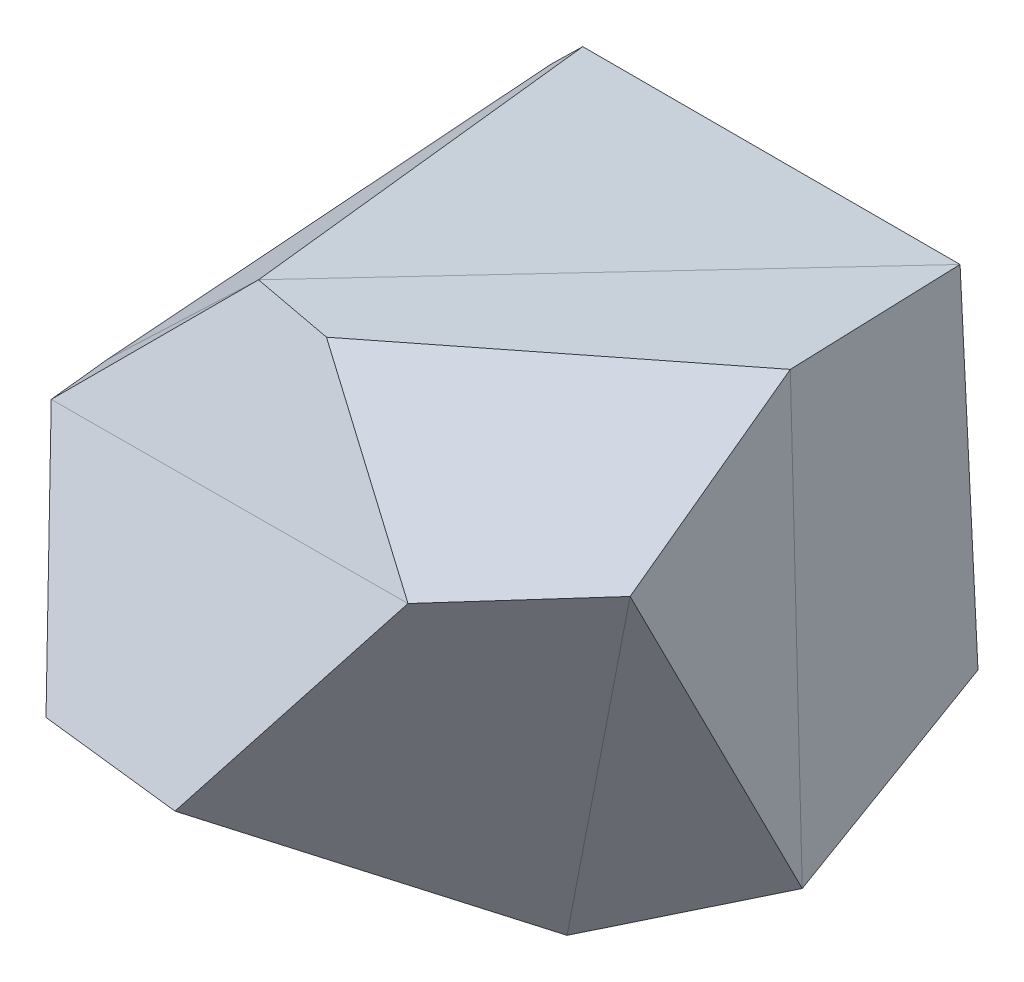
ISO-10303-21;
HEADER;
FILE_DESCRIPTION(('STEP AP214'),'2;1');
FILE_NAME('part.step','',(''),(''),'','','');
FILE_SCHEMA(('AUTOMOTIVE_DESIGN { 1 0 10303 214 1 1 1 1 }'));
ENDSEC;
DATA;
#1=APPLICATION_CONTEXT('core data for automotive mechanical design processes');
#2=APPLICATION_PROTOCOL_DEFINITION('international standard','automotive_design',2000,#1);
#3=PRODUCT_CONTEXT('',#1,'mechanical');
#4=PRODUCT('Part','Part','',(#3));
#5=PRODUCT_RELATED_PRODUCT_CATEGORY('part','',(#4));
#6=PRODUCT_DEFINITION_FORMATION('','',#4);
#7=PRODUCT_DEFINITION_CONTEXT('part definition',#1,'design');
#8=PRODUCT_DEFINITION('design','',#6,#7);
#9=PRODUCT_DEFINITION_SHAPE('','',#8);
#10=(LENGTH_UNIT() NAMED_UNIT(*) SI_UNIT(.MILLI.,.METRE.));
#11=(NAMED_UNIT(*) PLANE_ANGLE_UNIT() SI_UNIT($,.RADIAN.));
#12=(NAMED_UNIT(*) SI_UNIT($,.STERADIAN.) SOLID_ANGLE_UNIT());
#13=UNCERTAINTY_MEASURE_WITH_UNIT(LENGTH_MEASURE(1.E-05),#10,'distance_accuracy_value','');
#14=(GEOMETRIC_REPRESENTATION_CONTEXT(3) GLOBAL_UNCERTAINTY_ASSIGNED_CONTEXT((#13)) GLOBAL_UNIT_ASSIGNED_CONTEXT((#10,
#11,#12)) REPRESENTATION_CONTEXT('',''));
#15=CARTESIAN_POINT('',(0.,0.,0.));
#16=DIRECTION('',(0.,0.,1.));
#17=DIRECTION('',(1.,0.,0.));
#18=AXIS2_PLACEMENT_3D('',#15,#16,#17);
#19=CARTESIAN_POINT('',(-17.3170905850617,1.69383779565701,24.8144851609786));
#20=DIRECTION('',(-0.697306439009768,0.713370706215431,0.0697564737441214));
#21=DIRECTION('',(0.698510580917198,0.698142668591242,-0.157098003294179));
#22=AXIS2_PLACEMENT_3D('',#19,#20,#21);
#23=PLANE('',#22);
#24=DIRECTION('',(-0.698510580917198,-0.698142668591242,0.157098003294179));
#25=VECTOR('',#24,1.);
#26=CARTESIAN_POINT('',(-12.4275165186413,6.58083647579571,23.7147991379194));
#27=LINE('',#26,#25);
#28=CARTESIAN_POINT('',(-7.53794245222089,11.4678351559344,22.6151131148601));
#29=VERTEX_POINT('',#28);
#30=CARTESIAN_POINT('',(-17.3170905850617,1.69383779565701,24.8144851609786));
#31=VERTEX_POINT('',#30);
#32=EDGE_CURVE('E2373',#29,#31,#27,.T.);
#33=ORIENTED_EDGE('',*,*,#32,.F.);
#34=DIRECTION('',(0.716146176064987,0.689319770996764,0.10942078331133));
#35=VECTOR('',#34,1.);
#36=CARTESIAN_POINT('',(-12.6899135848342,6.50885376357589,21.8279376250384));
#37=LINE('',#36,#35);
#38=CARTESIAN_POINT('',(-17.8418847174476,1.54987237121737,21.0407621352167));
#39=VERTEX_POINT('',#38);
#40=EDGE_CURVE('E2360',#39,#29,#37,.T.);
#41=ORIENTED_EDGE('',*,*,#40,.F.);
#42=DIRECTION('',(-0.13764162046033,-0.0377588716932539,-0.989762118857611));
#43=VECTOR('',#42,1.);
#44=CARTESIAN_POINT('',(-17.5794876512546,1.62185508343719,22.9276236480976));
#45=LINE('',#44,#43);
#46=EDGE_CURVE('E2375',#31,#39,#45,.T.);
#47=ORIENTED_EDGE('',*,*,#46,.F.);
#48=EDGE_LOOP('',(#33,#41,#47));
#49=FACE_BOUND('',#48,.T.);
#50=ADVANCED_FACE('F2290',(#49),#23,.T.);
#51=CARTESIAN_POINT('',(-17.8418847174476,1.54987237121738,21.0407621352167));
#52=DIRECTION('',(-0.697306439009768,0.713370706215431,0.0697564737441219));
#53=DIRECTION('',(0.716146176064988,0.689319770996764,0.109420783311329));
#54=AXIS2_PLACEMENT_3D('',#51,#52,#53);
#55=PLANE('',#54);
#56=ORIENTED_EDGE('',*,*,#40,.T.);
#57=DIRECTION('',(-0.168703631068879,-0.068756641820179,-0.983265787602613));
#58=VECTOR('',#57,1.);
#59=CARTESIAN_POINT('',(-9.478034209513,10.6771337750023,11.3075565574301));
#60=LINE('',#59,#58);
#61=CARTESIAN_POINT('',(-11.4181259668051,9.88643239407028,0.));
#62=VERTEX_POINT('',#61);
#63=EDGE_CURVE('E2364',#29,#62,#60,.T.);
#64=ORIENTED_EDGE('',*,*,#63,.T.);
#65=DIRECTION('',(-0.715112684774103,-0.699009190265175,0.));
#66=VECTOR('',#65,1.);
#67=CARTESIAN_POINT('',(-13.2681531070752,8.07806568372831,0.));
#68=LINE('',#67,#66);
#69=CARTESIAN_POINT('',(-13.2681531070752,8.07806568372831,0.));
#70=VERTEX_POINT('',#69);
#71=EDGE_CURVE('E2398',#62,#70,#68,.T.);
#72=ORIENTED_EDGE('',*,*,#71,.T.);
#73=DIRECTION('',(-0.203276960460998,-0.290141925000486,0.935144983787407));
#74=VECTOR('',#73,1.);
#75=CARTESIAN_POINT('',(-15.5550189122614,4.81396902747284,10.5203810676083));
#76=LINE('',#75,#74);
#77=EDGE_CURVE('E2367',#70,#39,#76,.T.);
#78=ORIENTED_EDGE('',*,*,#77,.T.);
#79=EDGE_LOOP('',(#56,#64,#72,#78));
#80=FACE_BOUND('',#79,.T.);
#81=ADVANCED_FACE('F2362',(#80),#55,.T.);
#82=CARTESIAN_POINT('',(-7.53794245222089,11.4678351559344,22.6151131148601));
#83=DIRECTION('',(0.,-0.997564050259824,0.0697564737441288));
#84=DIRECTION('',(-0.168703631068879,-0.0687566418201791,-0.983265787602613));
#85=AXIS2_PLACEMENT_3D('',#82,#83,#84);
#86=PLANE('',#85);
#87=ORIENTED_EDGE('',*,*,#63,.F.);
#88=DIRECTION('',(0.620117057189685,-0.0547246021027576,-0.782598270702855));
#89=VECTOR('',#88,1.);
#90=CARTESIAN_POINT('',(1.421965790487,10.6771337750023,11.3075565574301));
#91=LINE('',#90,#89);
#92=CARTESIAN_POINT('',(10.3818740331949,9.88643239407028,0.));
#93=VERTEX_POINT('',#92);
#94=EDGE_CURVE('E2380',#29,#93,#91,.T.);
#95=ORIENTED_EDGE('',*,*,#94,.T.);
#96=DIRECTION('',(-1.,0.,0.));
#97=VECTOR('',#96,1.);
#98=CARTESIAN_POINT('',(10.3818740331949,9.88643239407028,0.));
#99=LINE('',#98,#97);
#100=EDGE_CURVE('E2387',#93,#62,#99,.T.);
#101=ORIENTED_EDGE('',*,*,#100,.T.);
#102=EDGE_LOOP('',(#87,#95,#101));
#103=FACE_BOUND('',#102,.T.);
#104=ADVANCED_FACE('F2383',(#103),#86,.F.);
#105=CARTESIAN_POINT('',(-17.3170905850617,1.69383779565702,24.8144851609786));
#106=DIRECTION('',(0.911844271777201,0.385377148631444,-0.1415078702398));
#107=DIRECTION('',(0.407239440110573,-0.805493803160699,0.430506412830448));
#108=AXIS2_PLACEMENT_3D('',#105,#106,#107);
#109=PLANE('',#108);
#110=DIRECTION('',(-0.407239440110573,0.805493803160698,-0.430506412830449));
#111=VECTOR('',#110,1.);
#112=CARTESIAN_POINT('',(-14.6700342243429,-3.54187192488753,27.6127768443765));
#113=LINE('',#112,#111);
#114=CARTESIAN_POINT('',(-12.0229778636242,-8.77758164543207,30.4110685277744));
#115=VERTEX_POINT('',#114);
#116=EDGE_CURVE('E2444',#115,#31,#113,.T.);
#117=ORIENTED_EDGE('',*,*,#116,.T.);
#118=ORIENTED_EDGE('',*,*,#46,.T.);
#119=DIRECTION('',(-0.353720935838255,0.912460440010524,0.205663426416831));
#120=VECTOR('',#119,1.);
#121=CARTESIAN_POINT('',(-14.2229849315628,-7.7854610976852,18.9366307298748));
#122=LINE('',#121,#120);
#123=CARTESIAN_POINT('',(-10.6040851456781,-17.1207945665878,16.8324993245329));
#124=VERTEX_POINT('',#123);
#125=EDGE_CURVE('E2481',#124,#39,#122,.T.);
#126=ORIENTED_EDGE('',*,*,#125,.F.);
#127=DIRECTION('',(0.0886807948716339,-0.521450807572231,-0.848660575202597));
#128=VECTOR('',#127,1.);
#129=CARTESIAN_POINT('',(-11.3135315046511,-12.9491881060099,23.6217839261537));
#130=LINE('',#129,#128);
#131=EDGE_CURVE('E2463',#115,#124,#130,.T.);
#132=ORIENTED_EDGE('',*,*,#131,.F.);
#133=EDGE_LOOP('',(#117,#118,#126,#132));
#134=FACE_BOUND('',#133,.T.);
#135=ADVANCED_FACE('F2635',(#134),#109,.F.);
#136=CARTESIAN_POINT('',(-13.2681531070752,8.07806568372831,0.));
#137=DIRECTION('',(0.951251242564197,0.167731259496517,0.258819045102525));
#138=DIRECTION('',(-0.203276960460998,-0.290141925000486,0.935144983787407));
#139=AXIS2_PLACEMENT_3D('',#136,#137,#138);
#140=PLANE('',#139);
#141=ORIENTED_EDGE('',*,*,#77,.F.);
#142=DIRECTION('',(0.173648177666927,-0.984807753012209,0.));
#143=VECTOR('',#142,1.);
#144=CARTESIAN_POINT('',(-9.96883773140354,-10.6332816235037,0.));
#145=LINE('',#144,#143);
#146=CARTESIAN_POINT('',(-9.96883773140353,-10.6332816235037,0.));
#147=VERTEX_POINT('',#146);
#148=EDGE_CURVE('E2445',#70,#147,#145,.T.);
#149=ORIENTED_EDGE('',*,*,#148,.T.);
#150=DIRECTION('',(0.185852240497515,0.357960417230337,-0.915053705745372));
#151=VECTOR('',#150,1.);
#152=CARTESIAN_POINT('',(-11.130414234513,-12.8705342311933,5.71908566090857));
#153=LINE('',#152,#151);
#154=CARTESIAN_POINT('',(-12.2919907376225,-15.1077868388829,11.4381713218171));
#155=VERTEX_POINT('',#154);
#156=EDGE_CURVE('E2431',#155,#147,#153,.T.);
#157=ORIENTED_EDGE('',*,*,#156,.F.);
#158=DIRECTION('',(-0.277325345169781,0.832374655615887,0.47983651967602));
#159=VECTOR('',#158,1.);
#160=CARTESIAN_POINT('',(-15.066937727535,-6.77895723383274,16.2394667285169));
#161=LINE('',#160,#159);
#162=EDGE_CURVE('E2478',#155,#39,#161,.T.);
#163=ORIENTED_EDGE('',*,*,#162,.T.);
#164=EDGE_LOOP('',(#141,#149,#157,#163));
#165=FACE_BOUND('',#164,.T.);
#166=ADVANCED_FACE('F2632',(#165),#140,.F.);
#167=CARTESIAN_POINT('',(-7.53794245222089,11.4678351559344,22.6151131148601));
#168=DIRECTION('',(0.185434071086402,-0.38862467590287,-0.902543664627763));
#169=DIRECTION('',(0.98059221660627,0.0136763441477141,0.195580833268383));
#170=AXIS2_PLACEMENT_3D('',#167,#168,#169);
#171=PLANE('',#170);
#172=DIRECTION('',(-0.980592216606269,-0.0136763441477145,-0.195580833268388));
#173=VECTOR('',#172,1.);
#174=CARTESIAN_POINT('',(-5.08646191070521,11.5020260163037,23.1040651980311));
#175=LINE('',#174,#173);
#176=CARTESIAN_POINT('',(-2.63498136918954,11.536216876673,23.593017281202));
#177=VERTEX_POINT('',#176);
#178=EDGE_CURVE('E2392',#177,#29,#175,.T.);
#179=ORIENTED_EDGE('',*,*,#178,.T.);
#180=ORIENTED_EDGE('',*,*,#32,.T.);
#181=DIRECTION('',(0.979785789586028,0.143279282545139,0.139609647656003));
#182=VECTOR('',#181,1.);
#183=CARTESIAN_POINT('',(-5.29779677535762,3.45148299939205,26.5271139740131));
#184=LINE('',#183,#182);
#185=CARTESIAN_POINT('',(6.72149703434643,5.20912820312708,28.2397427870475));
#186=VERTEX_POINT('',#185);
#187=EDGE_CURVE('E2441',#31,#186,#184,.T.);
#188=ORIENTED_EDGE('',*,*,#187,.T.);
#189=DIRECTION('',(0.766081335318227,-0.518043683815385,0.380460417568013));
#190=VECTOR('',#189,1.);
#191=CARTESIAN_POINT('',(2.04325783257845,8.37267253990002,25.9163800341248));
#192=LINE('',#191,#190);
#193=EDGE_CURVE('E2394',#177,#186,#192,.T.);
#194=ORIENTED_EDGE('',*,*,#193,.F.);
#195=EDGE_LOOP('',(#179,#180,#188,#194));
#196=FACE_BOUND('',#195,.T.);
#197=ADVANCED_FACE('F2393',(#196),#171,.F.);
#198=CARTESIAN_POINT('',(-2.63498136918954,11.536216876673,23.593017281202));
#199=DIRECTION('',(0.,-0.997564050259824,0.0697564737441287));
#200=DIRECTION('',(-0.98059221660627,-0.0136763441477141,-0.195580833268383));
#201=AXIS2_PLACEMENT_3D('',#198,#199,#200);
#202=PLANE('',#201);
#203=ORIENTED_EDGE('',*,*,#178,.F.);
#204=DIRECTION('',(0.743467110451561,-0.0466512112807496,-0.667143402997321));
#205=VECTOR('',#204,1.);
#206=CARTESIAN_POINT('',(4.42795618010029,11.0930303695059,17.2551549527275));
#207=LINE('',#206,#205);
#208=CARTESIAN_POINT('',(11.4908937293901,10.6498438623387,10.9172926242529));
#209=VERTEX_POINT('',#208);
#210=EDGE_CURVE('E2422',#177,#209,#207,.T.);
#211=ORIENTED_EDGE('',*,*,#210,.T.);
#212=DIRECTION('',(0.100819972381384,0.0694010425698604,0.992481147659356));
#213=VECTOR('',#212,1.);
#214=CARTESIAN_POINT('',(10.9363838812925,10.2681381282045,5.45864631212646));
#215=LINE('',#214,#213);
#216=EDGE_CURVE('E2402',#93,#209,#215,.T.);
#217=ORIENTED_EDGE('',*,*,#216,.F.);
#218=ORIENTED_EDGE('',*,*,#94,.F.);
#219=EDGE_LOOP('',(#203,#211,#217,#218));
#220=FACE_BOUND('',#219,.T.);
#221=ADVANCED_FACE('F2400',(#220),#202,.F.);
#222=CARTESIAN_POINT('',(0.,0.,0.));
#223=DIRECTION('',(0.,0.,-1.));
#224=DIRECTION('',(-1.,0.,0.));
#225=AXIS2_PLACEMENT_3D('',#222,#223,#224);
#226=PLANE('',#225);
#227=ORIENTED_EDGE('',*,*,#71,.F.);
#228=ORIENTED_EDGE('',*,*,#100,.F.);
#229=DIRECTION('',(0.0523359562429408,-0.998629534754574,0.));
#230=VECTOR('',#229,1.);
#231=CARTESIAN_POINT('',(10.9,0.,0.));
#232=LINE('',#231,#230);
#233=CARTESIAN_POINT('',(11.4181259668051,-9.88643239407028,0.));
#234=VERTEX_POINT('',#233);
#235=EDGE_CURVE('E2548',#93,#234,#232,.T.);
#236=ORIENTED_EDGE('',*,*,#235,.T.);
#237=DIRECTION('',(-0.999390827019096,-0.034899496702494,0.));
#238=VECTOR('',#237,1.);
#239=CARTESIAN_POINT('',(0.72464411770079,-10.259857008787,0.));
#240=LINE('',#239,#238);
#241=EDGE_CURVE('E2456',#234,#147,#240,.T.);
#242=ORIENTED_EDGE('',*,*,#241,.T.);
#243=ORIENTED_EDGE('',*,*,#148,.F.);
#244=EDGE_LOOP('',(#227,#228,#236,#242,#243));
#245=FACE_BOUND('',#244,.T.);
#246=ADVANCED_FACE('F2624',(#245),#226,.T.);
#247=CARTESIAN_POINT('',(-12.0229778636242,-8.77758164543207,30.4110685277744));
#248=DIRECTION('',(-0.185434071086399,0.38862467590287,0.902543664627764));
#249=DIRECTION('',(0.98264029874776,0.0680270581844439,0.172598848871256));
#250=AXIS2_PLACEMENT_3D('',#247,#248,#249);
#251=PLANE('',#250);
#252=DIRECTION('',(-0.98264029874776,-0.0680270581844436,-0.172598848871258));
#253=VECTOR('',#252,1.);
#254=CARTESIAN_POINT('',(-7.50283248938452,-8.46465717778363,31.2050232325822));
#255=LINE('',#254,#253);
#256=CARTESIAN_POINT('',(-2.98268711514483,-8.15173271013519,31.99897793739));
#257=VERTEX_POINT('',#256);
#258=EDGE_CURVE('E2482',#257,#115,#255,.T.);
#259=ORIENTED_EDGE('',*,*,#258,.F.);
#260=DIRECTION('',(0.573003944938722,0.788920108392442,-0.221971938899314));
#261=VECTOR('',#260,1.);
#262=CARTESIAN_POINT('',(1.8694049596008,-1.47130225350405,30.1193603622188));
#263=LINE('',#262,#261);
#264=EDGE_CURVE('E2434',#257,#186,#263,.T.);
#265=ORIENTED_EDGE('',*,*,#264,.T.);
#266=ORIENTED_EDGE('',*,*,#187,.F.);
#267=ORIENTED_EDGE('',*,*,#116,.F.);
#268=EDGE_LOOP('',(#259,#265,#266,#267));
#269=FACE_BOUND('',#268,.T.);
#270=ADVANCED_FACE('F2620',(#269),#251,.T.);
#271=CARTESIAN_POINT('',(-2.98268711514483,-8.15173271013519,31.99897793739));
#272=DIRECTION('',(-0.0324159458970242,-0.853077008252551,0.520777135099534));
#273=DIRECTION('',(-0.98264029874776,-0.0680270581844441,-0.172598848871257));
#274=AXIS2_PLACEMENT_3D('',#271,#272,#273);
#275=PLANE('',#274);
#276=ORIENTED_EDGE('',*,*,#258,.T.);
#277=ORIENTED_EDGE('',*,*,#131,.T.);
#278=DIRECTION('',(0.997300365300307,0.00674124226164611,0.073120017947504));
#279=VECTOR('',#278,1.);
#280=CARTESIAN_POINT('',(-2.4508699323833,-17.0656829864896,17.430276346851));
#281=LINE('',#280,#279);
#282=CARTESIAN_POINT('',(5.70234528091148,-17.0105714063915,18.0280533691691));
#283=VERTEX_POINT('',#282);
#284=EDGE_CURVE('E2438',#124,#283,#281,.T.);
#285=ORIENTED_EDGE('',*,*,#284,.T.);
#286=DIRECTION('',(0.464835501977712,-0.47413786668012,-0.747744100265026));
#287=VECTOR('',#286,1.);
#288=CARTESIAN_POINT('',(1.35982908288333,-12.5811520582633,25.0135156532796));
#289=LINE('',#288,#287);
#290=EDGE_CURVE('E2450',#257,#283,#289,.T.);
#291=ORIENTED_EDGE('',*,*,#290,.F.);
#292=EDGE_LOOP('',(#276,#277,#285,#291));
#293=FACE_BOUND('',#292,.T.);
#294=ADVANCED_FACE('F2617',(#293),#275,.T.);
#295=CARTESIAN_POINT('',(-10.6040851456781,-17.1207945665878,16.8324993245329));
#296=DIRECTION('',(-0.911844271777201,-0.385377148631445,0.141507870239799));
#297=DIRECTION('',(-0.353720935838255,0.912460440010523,0.205663426416831));
#298=AXIS2_PLACEMENT_3D('',#295,#296,#297);
#299=PLANE('',#298);
#300=ORIENTED_EDGE('',*,*,#125,.T.);
#301=ORIENTED_EDGE('',*,*,#162,.F.);
#302=DIRECTION('',(0.281317598657398,-0.335501287950818,0.89905466711929));
#303=VECTOR('',#302,1.);
#304=CARTESIAN_POINT('',(-11.4480379416503,-16.1142907027353,14.135335323175));
#305=LINE('',#304,#303);
#306=EDGE_CURVE('E2517',#155,#124,#305,.T.);
#307=ORIENTED_EDGE('',*,*,#306,.T.);
#308=EDGE_LOOP('',(#300,#301,#307));
#309=FACE_BOUND('',#308,.T.);
#310=ADVANCED_FACE('F2614',(#309),#299,.T.);
#311=CARTESIAN_POINT('',(12.8706924578688,-14.2938111334931,11.6066818357497));
#312=DIRECTION('',(0.0325814870160519,-0.933011714525877,-0.358367949545304));
#313=DIRECTION('',(-0.999454808768848,-0.0323308896214437,-0.00669319095144));
#314=AXIS2_PLACEMENT_3D('',#311,#312,#313);
#315=PLANE('',#314);
#316=DIRECTION('',(0.999454808768848,0.0323308896214437,0.00669319095144));
#317=VECTOR('',#316,1.);
#318=CARTESIAN_POINT('',(0.289350860123184,-14.700798986188,11.5224265787834));
#319=LINE('',#318,#317);
#320=CARTESIAN_POINT('',(12.8706924578688,-14.2938111334931,11.6066818357497));
#321=VERTEX_POINT('',#320);
#322=EDGE_CURVE('E2419',#155,#321,#319,.T.);
#323=ORIENTED_EDGE('',*,*,#322,.F.);
#324=ORIENTED_EDGE('',*,*,#156,.T.);
#325=ORIENTED_EDGE('',*,*,#241,.F.);
#326=DIRECTION('',(0.116205319285097,-0.352590299153826,0.928534546859977));
#327=VECTOR('',#326,1.);
#328=CARTESIAN_POINT('',(12.144409212337,-12.0901217637817,5.80334091787486));
#329=LINE('',#328,#327);
#330=EDGE_CURVE('E2569',#234,#321,#329,.T.);
#331=ORIENTED_EDGE('',*,*,#330,.T.);
#332=EDGE_LOOP('',(#323,#324,#325,#331));
#333=FACE_BOUND('',#332,.T.);
#334=ADVANCED_FACE('F2583',(#333),#315,.T.);
#335=CARTESIAN_POINT('',(-2.63498136918954,11.536216876673,23.593017281202));
#336=DIRECTION('',(-0.386362025763273,-0.844209413466156,-0.371530417682359));
#337=DIRECTION('',(0.743467110451561,-0.0466512112807494,-0.667143402997321));
#338=AXIS2_PLACEMENT_3D('',#335,#336,#337);
#339=PLANE('',#338);
#340=ORIENTED_EDGE('',*,*,#210,.F.);
#341=ORIENTED_EDGE('',*,*,#193,.T.);
#342=DIRECTION('',(0.679383208653904,0.0119624891411063,-0.733686141788623));
#343=VECTOR('',#342,1.);
#344=CARTESIAN_POINT('',(9.80681654749428,5.26345409859042,24.9078144424073));
#345=LINE('',#344,#343);
#346=CARTESIAN_POINT('',(12.8921360606421,5.31777999405377,21.575886097767));
#347=VERTEX_POINT('',#346);
#348=EDGE_CURVE('E2309',#186,#347,#345,.T.);
#349=ORIENTED_EDGE('',*,*,#348,.T.);
#350=DIRECTION('',(0.116770194271001,-0.444338655690417,0.88821612279284));
#351=VECTOR('',#350,1.);
#352=CARTESIAN_POINT('',(12.1915148950161,7.98381192819625,16.24658936101));
#353=LINE('',#352,#351);
#354=EDGE_CURVE('E2414',#209,#347,#353,.T.);
#355=ORIENTED_EDGE('',*,*,#354,.F.);
#356=EDGE_LOOP('',(#340,#341,#349,#355));
#357=FACE_BOUND('',#356,.T.);
#358=ADVANCED_FACE('F2609',(#357),#339,.F.);
#359=CARTESIAN_POINT('',(10.3818740331949,9.88643239407028,0.));
#360=DIRECTION('',(-0.993158937674856,-0.0520492543986403,0.104528463267657));
#361=DIRECTION('',(0.0523359562429406,-0.998629534754574,0.));
#362=AXIS2_PLACEMENT_3D('',#359,#360,#361);
#363=PLANE('',#362);
#364=ORIENTED_EDGE('',*,*,#235,.F.);
#365=ORIENTED_EDGE('',*,*,#216,.T.);
#366=DIRECTION('',(0.0552111647949575,-0.998093575634629,0.0275851691831752));
#367=VECTOR('',#366,1.);
#368=CARTESIAN_POINT('',(12.1807930936295,-1.8219836355772,11.2619872300013));
#369=LINE('',#368,#367);
#370=EDGE_CURVE('E2418',#209,#321,#369,.T.);
#371=ORIENTED_EDGE('',*,*,#370,.T.);
#372=ORIENTED_EDGE('',*,*,#330,.F.);
#373=EDGE_LOOP('',(#364,#365,#371,#372));
#374=FACE_BOUND('',#373,.T.);
#375=ADVANCED_FACE('F2588',(#374),#363,.F.);
#376=CARTESIAN_POINT('',(-2.98268711514483,-8.15173271013519,31.99897793739));
#377=DIRECTION('',(-0.696338993622022,0.325833592426564,-0.639487666814513));
#378=DIRECTION('',(0.573003944938722,0.788920108392442,-0.221971938899312));
#379=AXIS2_PLACEMENT_3D('',#376,#377,#378);
#380=PLANE('',#379);
#381=ORIENTED_EDGE('',*,*,#264,.F.);
#382=ORIENTED_EDGE('',*,*,#290,.T.);
#383=DIRECTION('',(0.303057835841469,0.94116533577077,0.149545173371054));
#384=VECTOR('',#383,1.);
#385=CARTESIAN_POINT('',(9.2972406707768,-5.84639570616886,19.8019697334681));
#386=LINE('',#385,#384);
#387=EDGE_CURVE('E2511',#283,#347,#386,.T.);
#388=ORIENTED_EDGE('',*,*,#387,.T.);
#389=ORIENTED_EDGE('',*,*,#348,.F.);
#390=EDGE_LOOP('',(#381,#382,#388,#389));
#391=FACE_BOUND('',#390,.T.);
#392=ADVANCED_FACE('F2604',(#391),#380,.F.);
#393=CARTESIAN_POINT('',(-12.2919907376225,-15.1077868388829,11.4381713218171));
#394=DIRECTION('',(0.0325814870160519,-0.933011714525878,-0.358367949545303));
#395=DIRECTION('',(0.999454808768848,0.0323308896214437,0.00669319095144));
#396=AXIS2_PLACEMENT_3D('',#393,#394,#395);
#397=PLANE('',#396);
#398=ORIENTED_EDGE('',*,*,#322,.T.);
#399=DIRECTION('',(-0.716834717695735,-0.271676027289834,0.642137153341939));
#400=VECTOR('',#399,1.);
#401=CARTESIAN_POINT('',(9.28651886939016,-15.6521912699423,14.8173676024594));
#402=LINE('',#401,#400);
#403=EDGE_CURVE('E2300',#321,#283,#402,.T.);
#404=ORIENTED_EDGE('',*,*,#403,.T.);
#405=ORIENTED_EDGE('',*,*,#284,.F.);
#406=ORIENTED_EDGE('',*,*,#306,.F.);
#407=EDGE_LOOP('',(#398,#404,#405,#406));
#408=FACE_BOUND('',#407,.T.);
#409=ADVANCED_FACE('F2591',(#408),#397,.T.);
#410=CARTESIAN_POINT('',(11.4908937293901,10.6498438623387,10.9172926242529));
#411=DIRECTION('',(-0.993158937674856,-0.0520492543986407,0.104528463267658));
#412=DIRECTION('',(0.0552111647949575,-0.998093575634629,0.027585169183175));
#413=AXIS2_PLACEMENT_3D('',#410,#411,#412);
#414=PLANE('',#413);
#415=ORIENTED_EDGE('',*,*,#370,.F.);
#416=ORIENTED_EDGE('',*,*,#354,.T.);
#417=DIRECTION('',(0.000974709216967292,0.89143596034304,0.453145648273514));
#418=VECTOR('',#417,1.);
#419=CARTESIAN_POINT('',(12.8814142592555,-4.48801556971968,16.5912839667584));
#420=LINE('',#419,#418);
#421=EDGE_CURVE('E13',#321,#347,#420,.T.);
#422=ORIENTED_EDGE('',*,*,#421,.F.);
#423=EDGE_LOOP('',(#415,#416,#422));
#424=FACE_BOUND('',#423,.T.);
#425=ADVANCED_FACE('F2592',(#424),#414,.F.);
#426=CARTESIAN_POINT('',(12.8706924578688,-14.2938111334931,11.6066818357497));
#427=DIRECTION('',(0.696338993622021,-0.325833592426564,0.639487666814513));
#428=DIRECTION('',(0.000974709216967686,0.891435960343041,0.453145648273514));
#429=AXIS2_PLACEMENT_3D('',#426,#427,#428);
#430=PLANE('',#429);
#431=ORIENTED_EDGE('',*,*,#421,.T.);
#432=ORIENTED_EDGE('',*,*,#387,.F.);
#433=ORIENTED_EDGE('',*,*,#403,.F.);
#434=EDGE_LOOP('',(#431,#432,#433));
#435=FACE_BOUND('',#434,.T.);
#436=ADVANCED_FACE('F2594',(#435),#430,.T.);
#437=CLOSED_SHELL('',(#50,#81,#104,#135,#166,#197,#221,#246,#270,#294,#310,#334,#358,#375,#392,
#409,#425,#436));
#438=MANIFOLD_SOLID_BREP('B2',#437);
#439=ADVANCED_BREP_SHAPE_REPRESENTATION('',(#18,#438),#14);
#440=SHAPE_DEFINITION_REPRESENTATION(#9,#439);
ENDSEC;
END-ISO-10303-21;
